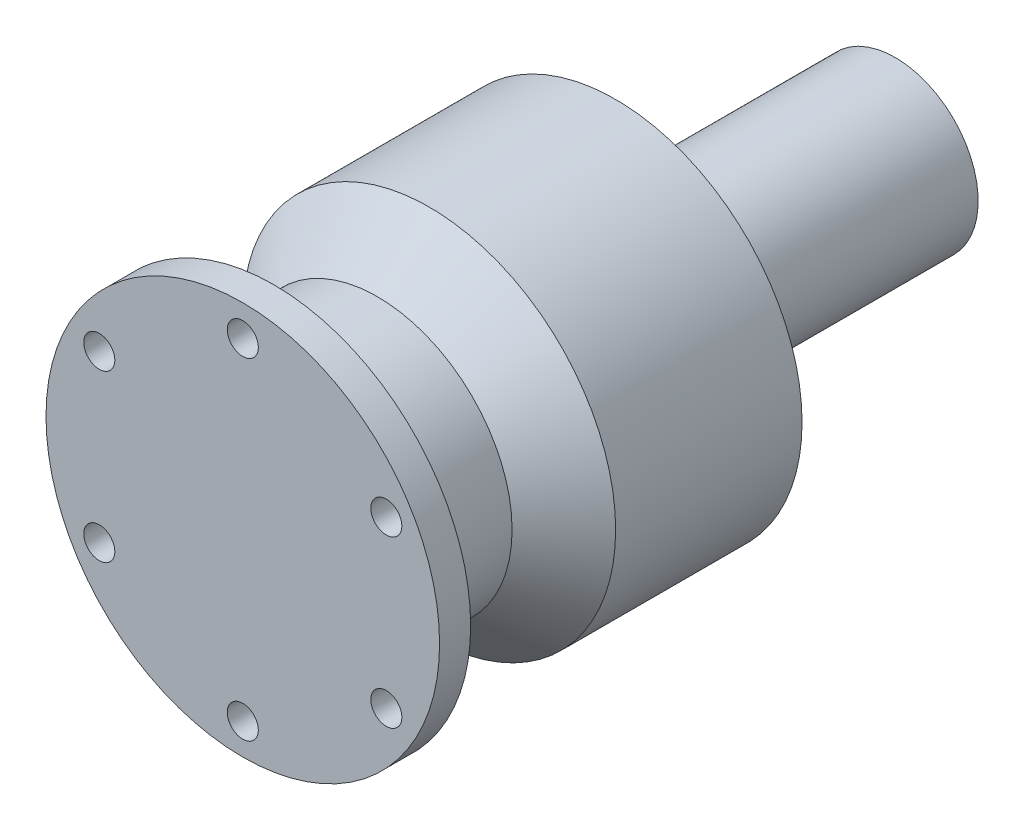
ISO-10303-21;
HEADER;
FILE_DESCRIPTION(('STEP AP214'),'2;1');
FILE_NAME('part.step','',(''),(''),'','','');
FILE_SCHEMA(('AUTOMOTIVE_DESIGN { 1 0 10303 214 1 1 1 1 }'));
ENDSEC;
DATA;
#1=APPLICATION_CONTEXT('core data for automotive mechanical design processes');
#2=APPLICATION_PROTOCOL_DEFINITION('international standard','automotive_design',2000,#1);
#3=PRODUCT_CONTEXT('',#1,'mechanical');
#4=PRODUCT('Part','Part','',(#3));
#5=PRODUCT_RELATED_PRODUCT_CATEGORY('part','',(#4));
#6=PRODUCT_DEFINITION_FORMATION('','',#4);
#7=PRODUCT_DEFINITION_CONTEXT('part definition',#1,'design');
#8=PRODUCT_DEFINITION('design','',#6,#7);
#9=PRODUCT_DEFINITION_SHAPE('','',#8);
#10=(LENGTH_UNIT() NAMED_UNIT(*) SI_UNIT(.MILLI.,.METRE.));
#11=(NAMED_UNIT(*) PLANE_ANGLE_UNIT() SI_UNIT($,.RADIAN.));
#12=(NAMED_UNIT(*) SI_UNIT($,.STERADIAN.) SOLID_ANGLE_UNIT());
#13=UNCERTAINTY_MEASURE_WITH_UNIT(LENGTH_MEASURE(1.E-05),#10,'distance_accuracy_value','');
#14=(GEOMETRIC_REPRESENTATION_CONTEXT(3) GLOBAL_UNCERTAINTY_ASSIGNED_CONTEXT((#13)) GLOBAL_UNIT_ASSIGNED_CONTEXT((#10,
#11,#12)) REPRESENTATION_CONTEXT('',''));
#15=CARTESIAN_POINT('',(0.,0.,0.));
#16=DIRECTION('',(0.,0.,1.));
#17=DIRECTION('',(1.,0.,0.));
#18=AXIS2_PLACEMENT_3D('',#15,#16,#17);
#19=CARTESIAN_POINT('',(0.,0.,30.));
#20=DIRECTION('',(0.,0.,-1.));
#21=DIRECTION('',(-1.,0.,0.));
#22=AXIS2_PLACEMENT_3D('',#19,#20,#21);
#23=CYLINDRICAL_SURFACE('',#22,18.);
#24=CARTESIAN_POINT('',(0.,0.,25.));
#25=DIRECTION('',(0.,0.,-1.));
#26=DIRECTION('',(-1.,0.,0.));
#27=AXIS2_PLACEMENT_3D('',#24,#25,#26);
#28=CIRCLE('',#27,18.);
#29=CARTESIAN_POINT('',(-18.,0.,25.));
#30=VERTEX_POINT('',#29);
#31=EDGE_CURVE('E48',#30,#30,#28,.F.);
#32=ORIENTED_EDGE('',*,*,#31,.F.);
#33=EDGE_LOOP('',(#32));
#34=FACE_BOUND('',#33,.T.);
#35=CARTESIAN_POINT('',(0.,0.,7.00207538209706));
#36=DIRECTION('',(0.,0.,1.));
#37=DIRECTION('',(1.,0.,0.));
#38=AXIS2_PLACEMENT_3D('',#35,#36,#37);
#39=CIRCLE('',#38,18.);
#40=CARTESIAN_POINT('',(18.,0.,7.00207538209706));
#41=VERTEX_POINT('',#40);
#42=EDGE_CURVE('E57',#41,#41,#39,.F.);
#43=ORIENTED_EDGE('',*,*,#42,.F.);
#44=EDGE_LOOP('',(#43));
#45=FACE_BOUND('',#44,.T.);
#46=ADVANCED_FACE('F38',(#34,#45),#23,.T.);
#47=CARTESIAN_POINT('',(0.,0.,30.));
#48=DIRECTION('',(0.,0.,-1.));
#49=DIRECTION('',(1.,0.,0.));
#50=AXIS2_PLACEMENT_3D('',#47,#48,#49);
#51=CONICAL_SURFACE('',#50,13.,0.78539816339745);
#52=CARTESIAN_POINT('',(0.,0.,30.));
#53=DIRECTION('',(0.,0.,1.));
#54=DIRECTION('',(1.,0.,0.));
#55=AXIS2_PLACEMENT_3D('',#52,#53,#54);
#56=CIRCLE('',#55,13.);
#57=CARTESIAN_POINT('',(13.,0.,30.));
#58=VERTEX_POINT('',#57);
#59=EDGE_CURVE('E52',#58,#58,#56,.T.);
#60=ORIENTED_EDGE('',*,*,#59,.F.);
#61=EDGE_LOOP('',(#60));
#62=FACE_BOUND('',#61,.T.);
#63=ORIENTED_EDGE('',*,*,#31,.T.);
#64=EDGE_LOOP('',(#63));
#65=FACE_BOUND('',#64,.T.);
#66=ADVANCED_FACE('F149',(#62,#65),#51,.T.);
#67=CARTESIAN_POINT('',(0.,0.,40.));
#68=DIRECTION('',(0.,0.,-1.));
#69=DIRECTION('',(-1.,0.,0.));
#70=AXIS2_PLACEMENT_3D('',#67,#68,#69);
#71=CYLINDRICAL_SURFACE('',#70,13.);
#72=CARTESIAN_POINT('',(0.,0.,40.));
#73=DIRECTION('',(0.,0.,1.));
#74=DIRECTION('',(1.,0.,0.));
#75=AXIS2_PLACEMENT_3D('',#72,#73,#74);
#76=CIRCLE('',#75,13.);
#77=CARTESIAN_POINT('',(13.,0.,40.));
#78=VERTEX_POINT('',#77);
#79=EDGE_CURVE('E11',#78,#78,#76,.T.);
#80=ORIENTED_EDGE('',*,*,#79,.F.);
#81=EDGE_LOOP('',(#80));
#82=FACE_BOUND('',#81,.T.);
#83=ORIENTED_EDGE('',*,*,#59,.T.);
#84=EDGE_LOOP('',(#83));
#85=FACE_BOUND('',#84,.T.);
#86=ADVANCED_FACE('F154',(#82,#85),#71,.T.);
#87=CARTESIAN_POINT('',(0.,0.,0.));
#88=DIRECTION('',(0.,0.,1.));
#89=DIRECTION('',(-1.,0.,0.));
#90=AXIS2_PLACEMENT_3D('',#87,#88,#89);
#91=CONICAL_SURFACE('',#90,8.,0.959931088596883);
#92=CARTESIAN_POINT('',(0.,0.,0.));
#93=DIRECTION('',(0.,0.,-1.));
#94=DIRECTION('',(-1.,0.,0.));
#95=AXIS2_PLACEMENT_3D('',#92,#93,#94);
#96=CIRCLE('',#95,8.);
#97=CARTESIAN_POINT('',(-8.,0.,0.));
#98=VERTEX_POINT('',#97);
#99=EDGE_CURVE('E60',#98,#98,#96,.T.);
#100=ORIENTED_EDGE('',*,*,#99,.F.);
#101=EDGE_LOOP('',(#100));
#102=FACE_BOUND('',#101,.T.);
#103=ORIENTED_EDGE('',*,*,#42,.T.);
#104=EDGE_LOOP('',(#103));
#105=FACE_BOUND('',#104,.T.);
#106=ADVANCED_FACE('F161',(#102,#105),#91,.T.);
#107=CARTESIAN_POINT('',(0.,0.,-20.));
#108=DIRECTION('',(0.,0.,-1.));
#109=DIRECTION('',(-1.,0.,0.));
#110=AXIS2_PLACEMENT_3D('',#107,#108,#109);
#111=PLANE('',#110);
#112=CARTESIAN_POINT('',(0.,0.,-20.));
#113=DIRECTION('',(0.,0.,-1.));
#114=DIRECTION('',(-1.,0.,0.));
#115=AXIS2_PLACEMENT_3D('',#112,#113,#114);
#116=CIRCLE('',#115,8.);
#117=CARTESIAN_POINT('',(-8.,0.,-20.));
#118=VERTEX_POINT('',#117);
#119=EDGE_CURVE('E44',#118,#118,#116,.T.);
#120=ORIENTED_EDGE('',*,*,#119,.T.);
#121=EDGE_LOOP('',(#120));
#122=FACE_BOUND('',#121,.T.);
#123=ADVANCED_FACE('F163',(#122),#111,.T.);
#124=CARTESIAN_POINT('',(0.,0.,-20.));
#125=DIRECTION('',(0.,0.,1.));
#126=DIRECTION('',(1.,0.,0.));
#127=AXIS2_PLACEMENT_3D('',#124,#125,#126);
#128=CYLINDRICAL_SURFACE('',#127,8.);
#129=ORIENTED_EDGE('',*,*,#119,.F.);
#130=EDGE_LOOP('',(#129));
#131=FACE_BOUND('',#130,.T.);
#132=ORIENTED_EDGE('',*,*,#99,.T.);
#133=EDGE_LOOP('',(#132));
#134=FACE_BOUND('',#133,.T.);
#135=ADVANCED_FACE('F135',(#131,#134),#128,.T.);
#136=CARTESIAN_POINT('',(0.,0.,43.));
#137=DIRECTION('',(0.,0.,-1.));
#138=DIRECTION('',(-1.,0.,0.));
#139=AXIS2_PLACEMENT_3D('',#136,#137,#138);
#140=CYLINDRICAL_SURFACE('',#139,19.);
#141=CARTESIAN_POINT('',(0.,0.,43.));
#142=DIRECTION('',(0.,0.,1.));
#143=DIRECTION('',(1.,0.,0.));
#144=AXIS2_PLACEMENT_3D('',#141,#142,#143);
#145=CIRCLE('',#144,19.);
#146=CARTESIAN_POINT('',(19.,0.,43.));
#147=VERTEX_POINT('',#146);
#148=EDGE_CURVE('E63',#147,#147,#145,.T.);
#149=ORIENTED_EDGE('',*,*,#148,.F.);
#150=EDGE_LOOP('',(#149));
#151=FACE_BOUND('',#150,.T.);
#152=CARTESIAN_POINT('',(0.,0.,40.));
#153=DIRECTION('',(0.,0.,1.));
#154=DIRECTION('',(1.,0.,0.));
#155=AXIS2_PLACEMENT_3D('',#152,#153,#154);
#156=CIRCLE('',#155,19.);
#157=CARTESIAN_POINT('',(19.,0.,40.));
#158=VERTEX_POINT('',#157);
#159=EDGE_CURVE('E64',#158,#158,#156,.T.);
#160=ORIENTED_EDGE('',*,*,#159,.T.);
#161=EDGE_LOOP('',(#160));
#162=FACE_BOUND('',#161,.T.);
#163=ADVANCED_FACE('F119',(#151,#162),#140,.T.);
#164=CARTESIAN_POINT('',(0.,0.,43.));
#165=DIRECTION('',(0.,0.,1.));
#166=DIRECTION('',(1.,0.,0.));
#167=AXIS2_PLACEMENT_3D('',#164,#165,#166);
#168=PLANE('',#167);
#169=CARTESIAN_POINT('',(6.35645718799631E-13,16.0000000000008,43.));
#170=DIRECTION('',(0.,0.,1.));
#171=DIRECTION('',(1.,0.,0.));
#172=AXIS2_PLACEMENT_3D('',#169,#170,#171);
#173=CIRCLE('',#172,1.49999999999916);
#174=CARTESIAN_POINT('',(1.4999999999998,16.0000000000008,43.));
#175=VERTEX_POINT('',#174);
#176=EDGE_CURVE('E95',#175,#175,#173,.T.);
#177=ORIENTED_EDGE('',*,*,#176,.F.);
#178=EDGE_LOOP('',(#177));
#179=FACE_BOUND('',#178,.T.);
#180=CARTESIAN_POINT('',(-13.8564064605509,8.00000000000016,43.));
#181=DIRECTION('',(0.,0.,1.));
#182=DIRECTION('',(1.,0.,0.));
#183=AXIS2_PLACEMENT_3D('',#180,#181,#182);
#184=CIRCLE('',#183,1.5);
#185=CARTESIAN_POINT('',(-12.3564064605509,8.00000000000016,43.));
#186=VERTEX_POINT('',#185);
#187=EDGE_CURVE('E74',#186,#186,#184,.T.);
#188=ORIENTED_EDGE('',*,*,#187,.F.);
#189=EDGE_LOOP('',(#188));
#190=FACE_BOUND('',#189,.T.);
#191=CARTESIAN_POINT('',(-13.8564064605507,-8.00000000000063,43.));
#192=DIRECTION('',(0.,0.,1.));
#193=DIRECTION('',(1.,0.,0.));
#194=AXIS2_PLACEMENT_3D('',#191,#192,#193);
#195=CIRCLE('',#194,1.50000000000084);
#196=CARTESIAN_POINT('',(-12.3564064605498,-8.00000000000063,43.));
#197=VERTEX_POINT('',#196);
#198=EDGE_CURVE('E73',#197,#197,#195,.T.);
#199=ORIENTED_EDGE('',*,*,#198,.F.);
#200=EDGE_LOOP('',(#199));
#201=FACE_BOUND('',#200,.T.);
#202=CARTESIAN_POINT('',(1.17746538011032E-12,-16.0000000000008,43.));
#203=DIRECTION('',(0.,0.,1.));
#204=DIRECTION('',(1.,0.,0.));
#205=AXIS2_PLACEMENT_3D('',#202,#203,#204);
#206=CIRCLE('',#205,1.500000000001);
#207=CARTESIAN_POINT('',(1.50000000000218,-16.0000000000008,43.));
#208=VERTEX_POINT('',#207);
#209=EDGE_CURVE('E80',#208,#208,#206,.T.);
#210=ORIENTED_EDGE('',*,*,#209,.F.);
#211=EDGE_LOOP('',(#210));
#212=FACE_BOUND('',#211,.T.);
#213=CARTESIAN_POINT('',(13.8564064605527,-8.00000000000015,43.));
#214=DIRECTION('',(0.,0.,1.));
#215=DIRECTION('',(1.,0.,0.));
#216=AXIS2_PLACEMENT_3D('',#213,#214,#215);
#217=CIRCLE('',#216,1.50000000000031);
#218=CARTESIAN_POINT('',(15.356406460553,-8.00000000000015,43.));
#219=VERTEX_POINT('',#218);
#220=EDGE_CURVE('E86',#219,#219,#217,.T.);
#221=ORIENTED_EDGE('',*,*,#220,.F.);
#222=EDGE_LOOP('',(#221));
#223=FACE_BOUND('',#222,.T.);
#224=CARTESIAN_POINT('',(13.8564064605525,8.00000000000063,43.));
#225=DIRECTION('',(0.,0.,1.));
#226=DIRECTION('',(1.,0.,0.));
#227=AXIS2_PLACEMENT_3D('',#224,#225,#226);
#228=CIRCLE('',#227,1.49999999999941);
#229=CARTESIAN_POINT('',(15.3564064605519,8.00000000000063,43.));
#230=VERTEX_POINT('',#229);
#231=EDGE_CURVE('E92',#230,#230,#228,.T.);
#232=ORIENTED_EDGE('',*,*,#231,.F.);
#233=EDGE_LOOP('',(#232));
#234=FACE_BOUND('',#233,.T.);
#235=ORIENTED_EDGE('',*,*,#148,.T.);
#236=EDGE_LOOP('',(#235));
#237=FACE_BOUND('',#236,.T.);
#238=ADVANCED_FACE('F116',(#179,#190,#201,#212,#223,#234,#237),#168,.T.);
#239=CARTESIAN_POINT('',(0.,0.,40.));
#240=DIRECTION('',(0.,0.,1.));
#241=DIRECTION('',(1.,0.,0.));
#242=AXIS2_PLACEMENT_3D('',#239,#240,#241);
#243=PLANE('',#242);
#244=CARTESIAN_POINT('',(6.35645718799631E-13,16.0000000000008,40.));
#245=DIRECTION('',(0.,0.,1.));
#246=DIRECTION('',(1.,0.,0.));
#247=AXIS2_PLACEMENT_3D('',#244,#245,#246);
#248=CIRCLE('',#247,1.49999999999916);
#249=CARTESIAN_POINT('',(1.4999999999998,16.0000000000008,40.));
#250=VERTEX_POINT('',#249);
#251=EDGE_CURVE('E67',#250,#250,#248,.T.);
#252=ORIENTED_EDGE('',*,*,#251,.T.);
#253=EDGE_LOOP('',(#252));
#254=FACE_BOUND('',#253,.T.);
#255=CARTESIAN_POINT('',(-13.8564064605509,8.00000000000016,40.));
#256=DIRECTION('',(0.,0.,1.));
#257=DIRECTION('',(1.,0.,0.));
#258=AXIS2_PLACEMENT_3D('',#255,#256,#257);
#259=CIRCLE('',#258,1.5);
#260=CARTESIAN_POINT('',(-12.3564064605509,8.00000000000016,40.));
#261=VERTEX_POINT('',#260);
#262=EDGE_CURVE('E96',#261,#261,#259,.T.);
#263=ORIENTED_EDGE('',*,*,#262,.T.);
#264=EDGE_LOOP('',(#263));
#265=FACE_BOUND('',#264,.T.);
#266=CARTESIAN_POINT('',(-13.8564064605507,-8.00000000000063,40.));
#267=DIRECTION('',(0.,0.,1.));
#268=DIRECTION('',(1.,0.,0.));
#269=AXIS2_PLACEMENT_3D('',#266,#267,#268);
#270=CIRCLE('',#269,1.50000000000084);
#271=CARTESIAN_POINT('',(-12.3564064605498,-8.00000000000063,40.));
#272=VERTEX_POINT('',#271);
#273=EDGE_CURVE('E70',#272,#272,#270,.T.);
#274=ORIENTED_EDGE('',*,*,#273,.T.);
#275=EDGE_LOOP('',(#274));
#276=FACE_BOUND('',#275,.T.);
#277=CARTESIAN_POINT('',(1.17746538011032E-12,-16.0000000000008,40.));
#278=DIRECTION('',(0.,0.,1.));
#279=DIRECTION('',(1.,0.,0.));
#280=AXIS2_PLACEMENT_3D('',#277,#278,#279);
#281=CIRCLE('',#280,1.500000000001);
#282=CARTESIAN_POINT('',(1.50000000000218,-16.0000000000008,40.));
#283=VERTEX_POINT('',#282);
#284=EDGE_CURVE('E77',#283,#283,#281,.T.);
#285=ORIENTED_EDGE('',*,*,#284,.T.);
#286=EDGE_LOOP('',(#285));
#287=FACE_BOUND('',#286,.T.);
#288=CARTESIAN_POINT('',(13.8564064605527,-8.00000000000015,40.));
#289=DIRECTION('',(0.,0.,1.));
#290=DIRECTION('',(1.,0.,0.));
#291=AXIS2_PLACEMENT_3D('',#288,#289,#290);
#292=CIRCLE('',#291,1.50000000000031);
#293=CARTESIAN_POINT('',(15.356406460553,-8.00000000000015,40.));
#294=VERTEX_POINT('',#293);
#295=EDGE_CURVE('E83',#294,#294,#292,.T.);
#296=ORIENTED_EDGE('',*,*,#295,.T.);
#297=EDGE_LOOP('',(#296));
#298=FACE_BOUND('',#297,.T.);
#299=CARTESIAN_POINT('',(13.8564064605525,8.00000000000063,40.));
#300=DIRECTION('',(0.,0.,1.));
#301=DIRECTION('',(1.,0.,0.));
#302=AXIS2_PLACEMENT_3D('',#299,#300,#301);
#303=CIRCLE('',#302,1.49999999999941);
#304=CARTESIAN_POINT('',(15.3564064605519,8.00000000000063,40.));
#305=VERTEX_POINT('',#304);
#306=EDGE_CURVE('E89',#305,#305,#303,.T.);
#307=ORIENTED_EDGE('',*,*,#306,.T.);
#308=EDGE_LOOP('',(#307));
#309=FACE_BOUND('',#308,.T.);
#310=ORIENTED_EDGE('',*,*,#79,.T.);
#311=EDGE_LOOP('',(#310));
#312=FACE_BOUND('',#311,.T.);
#313=ORIENTED_EDGE('',*,*,#159,.F.);
#314=EDGE_LOOP('',(#313));
#315=FACE_BOUND('',#314,.T.);
#316=ADVANCED_FACE('F106',(#254,#265,#276,#287,#298,#309,#312,#315),#243,.F.);
#317=CARTESIAN_POINT('',(13.8564064605525,8.00000000000063,40.));
#318=DIRECTION('',(0.,0.,1.));
#319=DIRECTION('',(1.,0.,0.));
#320=AXIS2_PLACEMENT_3D('',#317,#318,#319);
#321=CYLINDRICAL_SURFACE('',#320,1.49999999999941);
#322=ORIENTED_EDGE('',*,*,#306,.F.);
#323=EDGE_LOOP('',(#322));
#324=FACE_BOUND('',#323,.T.);
#325=ORIENTED_EDGE('',*,*,#231,.T.);
#326=EDGE_LOOP('',(#325));
#327=FACE_BOUND('',#326,.T.);
#328=ADVANCED_FACE('F140',(#324,#327),#321,.F.);
#329=CARTESIAN_POINT('',(13.8564064605527,-8.00000000000015,40.));
#330=DIRECTION('',(0.,0.,1.));
#331=DIRECTION('',(1.,0.,0.));
#332=AXIS2_PLACEMENT_3D('',#329,#330,#331);
#333=CYLINDRICAL_SURFACE('',#332,1.50000000000031);
#334=ORIENTED_EDGE('',*,*,#295,.F.);
#335=EDGE_LOOP('',(#334));
#336=FACE_BOUND('',#335,.T.);
#337=ORIENTED_EDGE('',*,*,#220,.T.);
#338=EDGE_LOOP('',(#337));
#339=FACE_BOUND('',#338,.T.);
#340=ADVANCED_FACE('F145',(#336,#339),#333,.F.);
#341=CARTESIAN_POINT('',(1.17746538011032E-12,-16.0000000000008,40.));
#342=DIRECTION('',(0.,0.,1.));
#343=DIRECTION('',(1.,0.,0.));
#344=AXIS2_PLACEMENT_3D('',#341,#342,#343);
#345=CYLINDRICAL_SURFACE('',#344,1.500000000001);
#346=ORIENTED_EDGE('',*,*,#284,.F.);
#347=EDGE_LOOP('',(#346));
#348=FACE_BOUND('',#347,.T.);
#349=ORIENTED_EDGE('',*,*,#209,.T.);
#350=EDGE_LOOP('',(#349));
#351=FACE_BOUND('',#350,.T.);
#352=ADVANCED_FACE('F212',(#348,#351),#345,.F.);
#353=CARTESIAN_POINT('',(-13.8564064605507,-8.00000000000063,40.));
#354=DIRECTION('',(0.,0.,1.));
#355=DIRECTION('',(1.,0.,0.));
#356=AXIS2_PLACEMENT_3D('',#353,#354,#355);
#357=CYLINDRICAL_SURFACE('',#356,1.50000000000084);
#358=ORIENTED_EDGE('',*,*,#273,.F.);
#359=EDGE_LOOP('',(#358));
#360=FACE_BOUND('',#359,.T.);
#361=ORIENTED_EDGE('',*,*,#198,.T.);
#362=EDGE_LOOP('',(#361));
#363=FACE_BOUND('',#362,.T.);
#364=ADVANCED_FACE('F223',(#360,#363),#357,.F.);
#365=CARTESIAN_POINT('',(-13.8564064605509,8.00000000000016,40.));
#366=DIRECTION('',(0.,0.,1.));
#367=DIRECTION('',(1.,0.,0.));
#368=AXIS2_PLACEMENT_3D('',#365,#366,#367);
#369=CYLINDRICAL_SURFACE('',#368,1.5);
#370=ORIENTED_EDGE('',*,*,#262,.F.);
#371=EDGE_LOOP('',(#370));
#372=FACE_BOUND('',#371,.T.);
#373=ORIENTED_EDGE('',*,*,#187,.T.);
#374=EDGE_LOOP('',(#373));
#375=FACE_BOUND('',#374,.T.);
#376=ADVANCED_FACE('F112',(#372,#375),#369,.F.);
#377=CARTESIAN_POINT('',(6.35645718799631E-13,16.0000000000008,40.));
#378=DIRECTION('',(0.,0.,1.));
#379=DIRECTION('',(1.,0.,0.));
#380=AXIS2_PLACEMENT_3D('',#377,#378,#379);
#381=CYLINDRICAL_SURFACE('',#380,1.49999999999916);
#382=ORIENTED_EDGE('',*,*,#251,.F.);
#383=EDGE_LOOP('',(#382));
#384=FACE_BOUND('',#383,.T.);
#385=ORIENTED_EDGE('',*,*,#176,.T.);
#386=EDGE_LOOP('',(#385));
#387=FACE_BOUND('',#386,.T.);
#388=ADVANCED_FACE('F109',(#384,#387),#381,.F.);
#389=CLOSED_SHELL('',(#46,#66,#86,#106,#123,#135,#163,#238,#316,#328,#340,#352,#364,#376,#388));
#390=MANIFOLD_SOLID_BREP('B2',#389);
#391=ADVANCED_BREP_SHAPE_REPRESENTATION('',(#18,#390),#14);
#392=SHAPE_DEFINITION_REPRESENTATION(#9,#391);
ENDSEC;
END-ISO-10303-21;
